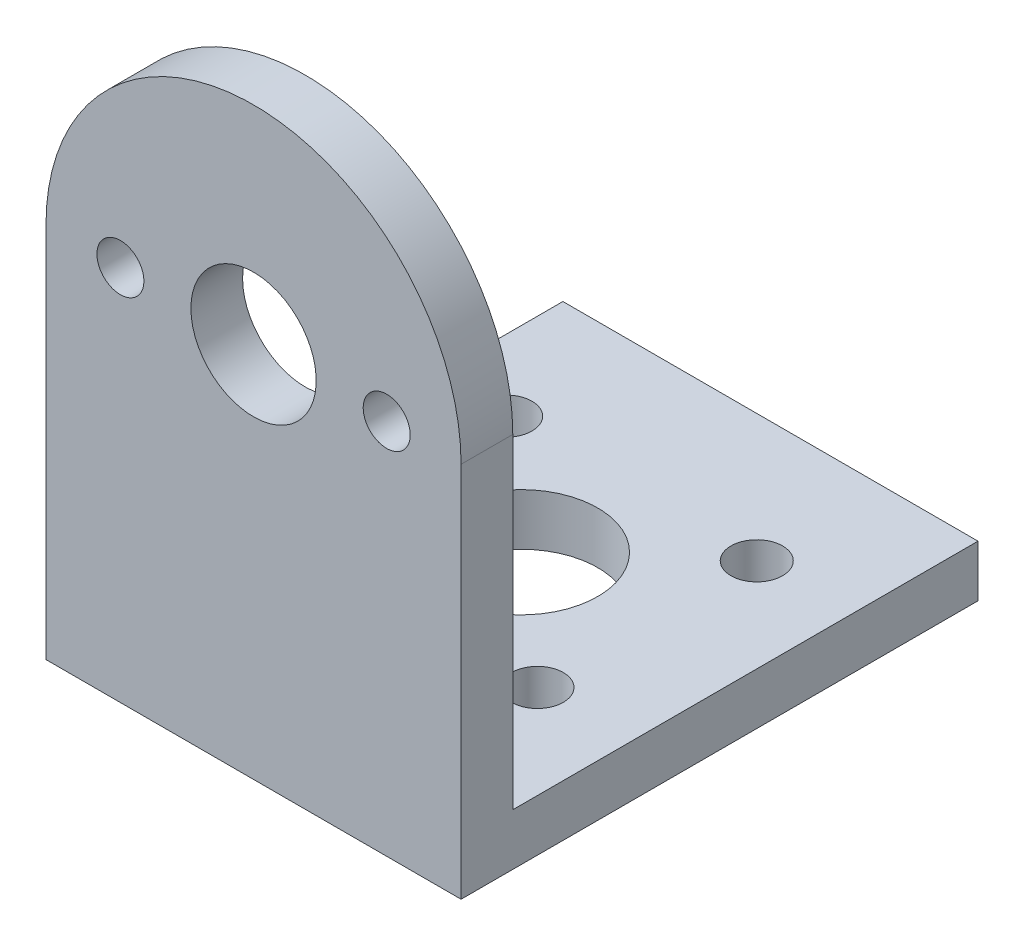
ISO-10303-21;
HEADER;
FILE_DESCRIPTION(('STEP AP214'),'2;1');
FILE_NAME('part.step','',(''),(''),'','','');
FILE_SCHEMA(('AUTOMOTIVE_DESIGN { 1 0 10303 214 1 1 1 1 }'));
ENDSEC;
DATA;
#1=APPLICATION_CONTEXT('core data for automotive mechanical design processes');
#2=APPLICATION_PROTOCOL_DEFINITION('international standard','automotive_design',2000,#1);
#3=PRODUCT_CONTEXT('',#1,'mechanical');
#4=PRODUCT('Part','Part','',(#3));
#5=PRODUCT_RELATED_PRODUCT_CATEGORY('part','',(#4));
#6=PRODUCT_DEFINITION_FORMATION('','',#4);
#7=PRODUCT_DEFINITION_CONTEXT('part definition',#1,'design');
#8=PRODUCT_DEFINITION('design','',#6,#7);
#9=PRODUCT_DEFINITION_SHAPE('','',#8);
#10=(LENGTH_UNIT() NAMED_UNIT(*) SI_UNIT(.MILLI.,.METRE.));
#11=(NAMED_UNIT(*) PLANE_ANGLE_UNIT() SI_UNIT($,.RADIAN.));
#12=(NAMED_UNIT(*) SI_UNIT($,.STERADIAN.) SOLID_ANGLE_UNIT());
#13=UNCERTAINTY_MEASURE_WITH_UNIT(LENGTH_MEASURE(1.E-05),#10,'distance_accuracy_value','');
#14=(GEOMETRIC_REPRESENTATION_CONTEXT(3) GLOBAL_UNCERTAINTY_ASSIGNED_CONTEXT((#13)) GLOBAL_UNIT_ASSIGNED_CONTEXT((#10,
#11,#12)) REPRESENTATION_CONTEXT('',''));
#15=CARTESIAN_POINT('',(0.,0.,0.));
#16=DIRECTION('',(0.,0.,1.));
#17=DIRECTION('',(1.,0.,0.));
#18=AXIS2_PLACEMENT_3D('',#15,#16,#17);
#19=CARTESIAN_POINT('',(0.,3.3,0.));
#20=DIRECTION('',(0.,0.,-1.));
#21=DIRECTION('',(-1.,0.,0.));
#22=AXIS2_PLACEMENT_3D('',#19,#20,#21);
#23=PLANE('',#22);
#24=CARTESIAN_POINT('',(21.75,24.05,0.));
#25=DIRECTION('',(0.,0.,-1.));
#26=DIRECTION('',(-1.,0.,0.));
#27=AXIS2_PLACEMENT_3D('',#24,#25,#26);
#28=CIRCLE('',#27,1.5);
#29=CARTESIAN_POINT('',(20.25,24.05,0.));
#30=VERTEX_POINT('',#29);
#31=EDGE_CURVE('E177',#30,#30,#28,.T.);
#32=ORIENTED_EDGE('',*,*,#31,.T.);
#33=EDGE_LOOP('',(#32));
#34=FACE_BOUND('',#33,.T.);
#35=CARTESIAN_POINT('',(4.75,24.05,0.));
#36=DIRECTION('',(0.,0.,-1.));
#37=DIRECTION('',(-1.,0.,0.));
#38=AXIS2_PLACEMENT_3D('',#35,#36,#37);
#39=CIRCLE('',#38,1.5);
#40=CARTESIAN_POINT('',(3.25,24.05,0.));
#41=VERTEX_POINT('',#40);
#42=EDGE_CURVE('E182',#41,#41,#39,.T.);
#43=ORIENTED_EDGE('',*,*,#42,.T.);
#44=EDGE_LOOP('',(#43));
#45=FACE_BOUND('',#44,.T.);
#46=CARTESIAN_POINT('',(13.25,24.05,0.));
#47=DIRECTION('',(0.,0.,-1.));
#48=DIRECTION('',(-1.,0.,0.));
#49=AXIS2_PLACEMENT_3D('',#46,#47,#48);
#50=CIRCLE('',#49,4.);
#51=CARTESIAN_POINT('',(9.25,24.05,0.));
#52=VERTEX_POINT('',#51);
#53=EDGE_CURVE('E185',#52,#52,#50,.T.);
#54=ORIENTED_EDGE('',*,*,#53,.T.);
#55=EDGE_LOOP('',(#54));
#56=FACE_BOUND('',#55,.T.);
#57=CARTESIAN_POINT('',(13.25,24.05,0.));
#58=DIRECTION('',(0.,0.,-1.));
#59=DIRECTION('',(-1.,0.,0.));
#60=AXIS2_PLACEMENT_3D('',#57,#58,#59);
#61=CIRCLE('',#60,13.25);
#62=CARTESIAN_POINT('',(0.,24.05,0.));
#63=VERTEX_POINT('',#62);
#64=CARTESIAN_POINT('',(26.5,24.05,0.));
#65=VERTEX_POINT('',#64);
#66=EDGE_CURVE('E121',#63,#65,#61,.T.);
#67=ORIENTED_EDGE('',*,*,#66,.F.);
#68=DIRECTION('',(0.,-1.,0.));
#69=VECTOR('',#68,1.);
#70=CARTESIAN_POINT('',(0.,3.3,0.));
#71=LINE('',#70,#69);
#72=CARTESIAN_POINT('',(0.,0.,0.));
#73=VERTEX_POINT('',#72);
#74=EDGE_CURVE('E45',#63,#73,#71,.T.);
#75=ORIENTED_EDGE('',*,*,#74,.T.);
#76=DIRECTION('',(1.,0.,0.));
#77=VECTOR('',#76,1.);
#78=CARTESIAN_POINT('',(0.,0.,0.));
#79=LINE('',#78,#77);
#80=CARTESIAN_POINT('',(26.5,0.,0.));
#81=VERTEX_POINT('',#80);
#82=EDGE_CURVE('E103',#73,#81,#79,.T.);
#83=ORIENTED_EDGE('',*,*,#82,.T.);
#84=DIRECTION('',(0.,-1.,0.));
#85=VECTOR('',#84,1.);
#86=CARTESIAN_POINT('',(26.5,3.3,0.));
#87=LINE('',#86,#85);
#88=EDGE_CURVE('E115',#65,#81,#87,.T.);
#89=ORIENTED_EDGE('',*,*,#88,.F.);
#90=EDGE_LOOP('',(#67,#75,#83,#89));
#91=FACE_BOUND('',#90,.T.);
#92=ADVANCED_FACE('F37',(#34,#45,#56,#91),#23,.F.);
#93=CARTESIAN_POINT('',(0.,37.3,-3.3));
#94=DIRECTION('',(0.,0.,1.));
#95=DIRECTION('',(1.,0.,0.));
#96=AXIS2_PLACEMENT_3D('',#93,#94,#95);
#97=PLANE('',#96);
#98=CARTESIAN_POINT('',(21.75,24.05,-3.3));
#99=DIRECTION('',(0.,0.,-1.));
#100=DIRECTION('',(-1.,0.,0.));
#101=AXIS2_PLACEMENT_3D('',#98,#99,#100);
#102=CIRCLE('',#101,1.5);
#103=CARTESIAN_POINT('',(20.25,24.05,-3.3));
#104=VERTEX_POINT('',#103);
#105=EDGE_CURVE('E192',#104,#104,#102,.T.);
#106=ORIENTED_EDGE('',*,*,#105,.F.);
#107=EDGE_LOOP('',(#106));
#108=FACE_BOUND('',#107,.T.);
#109=CARTESIAN_POINT('',(4.75,24.05,-3.3));
#110=DIRECTION('',(0.,0.,-1.));
#111=DIRECTION('',(-1.,0.,0.));
#112=AXIS2_PLACEMENT_3D('',#109,#110,#111);
#113=CIRCLE('',#112,1.5);
#114=CARTESIAN_POINT('',(3.25,24.05,-3.3));
#115=VERTEX_POINT('',#114);
#116=EDGE_CURVE('E191',#115,#115,#113,.T.);
#117=ORIENTED_EDGE('',*,*,#116,.F.);
#118=EDGE_LOOP('',(#117));
#119=FACE_BOUND('',#118,.T.);
#120=CARTESIAN_POINT('',(13.25,24.05,-3.3));
#121=DIRECTION('',(0.,0.,-1.));
#122=DIRECTION('',(-1.,0.,0.));
#123=AXIS2_PLACEMENT_3D('',#120,#121,#122);
#124=CIRCLE('',#123,4.);
#125=CARTESIAN_POINT('',(9.25,24.05,-3.3));
#126=VERTEX_POINT('',#125);
#127=EDGE_CURVE('E188',#126,#126,#124,.T.);
#128=ORIENTED_EDGE('',*,*,#127,.F.);
#129=EDGE_LOOP('',(#128));
#130=FACE_BOUND('',#129,.T.);
#131=DIRECTION('',(0.,-1.,0.));
#132=VECTOR('',#131,1.);
#133=CARTESIAN_POINT('',(0.,37.3,-3.3));
#134=LINE('',#133,#132);
#135=CARTESIAN_POINT('',(0.,24.05,-3.3));
#136=VERTEX_POINT('',#135);
#137=CARTESIAN_POINT('',(0.,3.3,-3.3));
#138=VERTEX_POINT('',#137);
#139=EDGE_CURVE('E133',#136,#138,#134,.T.);
#140=ORIENTED_EDGE('',*,*,#139,.F.);
#141=CARTESIAN_POINT('',(13.25,24.05,-3.3));
#142=DIRECTION('',(0.,0.,-1.));
#143=DIRECTION('',(-1.,0.,0.));
#144=AXIS2_PLACEMENT_3D('',#141,#142,#143);
#145=CIRCLE('',#144,13.25);
#146=CARTESIAN_POINT('',(26.5,24.05,-3.3));
#147=VERTEX_POINT('',#146);
#148=EDGE_CURVE('E176',#136,#147,#145,.T.);
#149=ORIENTED_EDGE('',*,*,#148,.T.);
#150=DIRECTION('',(0.,-1.,0.));
#151=VECTOR('',#150,1.);
#152=CARTESIAN_POINT('',(26.5,37.3,-3.3));
#153=LINE('',#152,#151);
#154=CARTESIAN_POINT('',(26.5,3.3,-3.3));
#155=VERTEX_POINT('',#154);
#156=EDGE_CURVE('E52',#147,#155,#153,.T.);
#157=ORIENTED_EDGE('',*,*,#156,.T.);
#158=DIRECTION('',(-1.,0.,0.));
#159=VECTOR('',#158,1.);
#160=CARTESIAN_POINT('',(0.,3.3,-3.3));
#161=LINE('',#160,#159);
#162=EDGE_CURVE('E134',#155,#138,#161,.T.);
#163=ORIENTED_EDGE('',*,*,#162,.T.);
#164=EDGE_LOOP('',(#140,#149,#157,#163));
#165=FACE_BOUND('',#164,.T.);
#166=ADVANCED_FACE('F140',(#108,#119,#130,#165),#97,.F.);
#167=CARTESIAN_POINT('',(26.5,3.3,0.));
#168=DIRECTION('',(-1.,0.,0.));
#169=DIRECTION('',(0.,0.,1.));
#170=AXIS2_PLACEMENT_3D('',#167,#168,#169);
#171=PLANE('',#170);
#172=DIRECTION('',(0.,0.,-1.));
#173=VECTOR('',#172,1.);
#174=CARTESIAN_POINT('',(26.5,24.05,30.7));
#175=LINE('',#174,#173);
#176=EDGE_CURVE('E142',#65,#147,#175,.T.);
#177=ORIENTED_EDGE('',*,*,#176,.F.);
#178=ORIENTED_EDGE('',*,*,#88,.T.);
#179=DIRECTION('',(0.,0.,-1.));
#180=VECTOR('',#179,1.);
#181=CARTESIAN_POINT('',(26.5,0.,0.));
#182=LINE('',#181,#180);
#183=CARTESIAN_POINT('',(26.5,0.,-33.));
#184=VERTEX_POINT('',#183);
#185=EDGE_CURVE('E91',#81,#184,#182,.T.);
#186=ORIENTED_EDGE('',*,*,#185,.T.);
#187=DIRECTION('',(0.,-1.,0.));
#188=VECTOR('',#187,1.);
#189=CARTESIAN_POINT('',(26.5,3.3,-33.));
#190=LINE('',#189,#188);
#191=CARTESIAN_POINT('',(26.5,3.3,-33.));
#192=VERTEX_POINT('',#191);
#193=EDGE_CURVE('E86',#192,#184,#190,.T.);
#194=ORIENTED_EDGE('',*,*,#193,.F.);
#195=DIRECTION('',(0.,0.,-1.));
#196=VECTOR('',#195,1.);
#197=CARTESIAN_POINT('',(26.5,3.3,0.));
#198=LINE('',#197,#196);
#199=EDGE_CURVE('E138',#155,#192,#198,.T.);
#200=ORIENTED_EDGE('',*,*,#199,.F.);
#201=ORIENTED_EDGE('',*,*,#156,.F.);
#202=EDGE_LOOP('',(#177,#178,#186,#194,#200,#201));
#203=FACE_BOUND('',#202,.T.);
#204=ADVANCED_FACE('F174',(#203),#171,.F.);
#205=CARTESIAN_POINT('',(0.,3.3,0.));
#206=DIRECTION('',(0.,-1.,0.));
#207=DIRECTION('',(0.,0.,-1.));
#208=AXIS2_PLACEMENT_3D('',#205,#206,#207);
#209=PLANE('',#208);
#210=CARTESIAN_POINT('',(20.5255800312338,3.3,-10.85));
#211=DIRECTION('',(0.,1.,0.));
#212=DIRECTION('',(0.,0.,1.));
#213=AXIS2_PLACEMENT_3D('',#210,#211,#212);
#214=CIRCLE('',#213,1.65);
#215=CARTESIAN_POINT('',(20.5255800312338,3.3,-9.2));
#216=VERTEX_POINT('',#215);
#217=EDGE_CURVE('E148',#216,#216,#214,.T.);
#218=ORIENTED_EDGE('',*,*,#217,.F.);
#219=EDGE_LOOP('',(#218));
#220=FACE_BOUND('',#219,.T.);
#221=CARTESIAN_POINT('',(4.5255800312338,3.3,-10.85));
#222=DIRECTION('',(0.,1.,0.));
#223=DIRECTION('',(0.,0.,1.));
#224=AXIS2_PLACEMENT_3D('',#221,#222,#223);
#225=CIRCLE('',#224,1.65);
#226=CARTESIAN_POINT('',(4.5255800312338,3.3,-9.2));
#227=VERTEX_POINT('',#226);
#228=EDGE_CURVE('E154',#227,#227,#225,.T.);
#229=ORIENTED_EDGE('',*,*,#228,.F.);
#230=EDGE_LOOP('',(#229));
#231=FACE_BOUND('',#230,.T.);
#232=CARTESIAN_POINT('',(20.5255800312338,3.3,-24.85));
#233=DIRECTION('',(0.,1.,0.));
#234=DIRECTION('',(0.,0.,-1.));
#235=AXIS2_PLACEMENT_3D('',#232,#233,#234);
#236=CIRCLE('',#235,1.65);
#237=CARTESIAN_POINT('',(20.5255800312338,3.3,-26.5));
#238=VERTEX_POINT('',#237);
#239=EDGE_CURVE('E160',#238,#238,#236,.T.);
#240=ORIENTED_EDGE('',*,*,#239,.F.);
#241=EDGE_LOOP('',(#240));
#242=FACE_BOUND('',#241,.T.);
#243=CARTESIAN_POINT('',(4.5255800312338,3.3,-24.85));
#244=DIRECTION('',(0.,1.,0.));
#245=DIRECTION('',(0.,0.,1.));
#246=AXIS2_PLACEMENT_3D('',#243,#244,#245);
#247=CIRCLE('',#246,1.65);
#248=CARTESIAN_POINT('',(4.5255800312338,3.3,-23.2));
#249=VERTEX_POINT('',#248);
#250=EDGE_CURVE('E166',#249,#249,#247,.T.);
#251=ORIENTED_EDGE('',*,*,#250,.F.);
#252=EDGE_LOOP('',(#251));
#253=FACE_BOUND('',#252,.T.);
#254=CARTESIAN_POINT('',(12.5255800312338,3.3,-17.8));
#255=DIRECTION('',(0.,1.,0.));
#256=DIRECTION('',(0.,0.,1.));
#257=AXIS2_PLACEMENT_3D('',#254,#255,#256);
#258=CIRCLE('',#257,4.9);
#259=CARTESIAN_POINT('',(12.5255800312338,3.3,-12.9));
#260=VERTEX_POINT('',#259);
#261=EDGE_CURVE('E104',#260,#260,#258,.T.);
#262=ORIENTED_EDGE('',*,*,#261,.F.);
#263=EDGE_LOOP('',(#262));
#264=FACE_BOUND('',#263,.T.);
#265=ORIENTED_EDGE('',*,*,#162,.F.);
#266=ORIENTED_EDGE('',*,*,#199,.T.);
#267=DIRECTION('',(-1.,0.,0.));
#268=VECTOR('',#267,1.);
#269=CARTESIAN_POINT('',(0.,3.3,-33.));
#270=LINE('',#269,#268);
#271=CARTESIAN_POINT('',(0.,3.3,-33.));
#272=VERTEX_POINT('',#271);
#273=EDGE_CURVE('E61',#192,#272,#270,.T.);
#274=ORIENTED_EDGE('',*,*,#273,.T.);
#275=DIRECTION('',(0.,0.,1.));
#276=VECTOR('',#275,1.);
#277=CARTESIAN_POINT('',(0.,3.3,0.));
#278=LINE('',#277,#276);
#279=EDGE_CURVE('E90',#272,#138,#278,.T.);
#280=ORIENTED_EDGE('',*,*,#279,.T.);
#281=EDGE_LOOP('',(#265,#266,#274,#280));
#282=FACE_BOUND('',#281,.T.);
#283=ADVANCED_FACE('F136',(#220,#231,#242,#253,#264,#282),#209,.F.);
#284=CARTESIAN_POINT('',(0.,0.,0.));
#285=DIRECTION('',(0.,-1.,0.));
#286=DIRECTION('',(0.,0.,-1.));
#287=AXIS2_PLACEMENT_3D('',#284,#285,#286);
#288=PLANE('',#287);
#289=CARTESIAN_POINT('',(4.5255800312338,0.,-10.85));
#290=DIRECTION('',(0.,1.,0.));
#291=DIRECTION('',(0.,0.,1.));
#292=AXIS2_PLACEMENT_3D('',#289,#290,#291);
#293=CIRCLE('',#292,1.65);
#294=CARTESIAN_POINT('',(4.5255800312338,0.,-9.2));
#295=VERTEX_POINT('',#294);
#296=EDGE_CURVE('E151',#295,#295,#293,.T.);
#297=ORIENTED_EDGE('',*,*,#296,.T.);
#298=EDGE_LOOP('',(#297));
#299=FACE_BOUND('',#298,.T.);
#300=CARTESIAN_POINT('',(4.5255800312338,0.,-24.85));
#301=DIRECTION('',(0.,1.,0.));
#302=DIRECTION('',(0.,0.,1.));
#303=AXIS2_PLACEMENT_3D('',#300,#301,#302);
#304=CIRCLE('',#303,1.65);
#305=CARTESIAN_POINT('',(4.5255800312338,0.,-23.2));
#306=VERTEX_POINT('',#305);
#307=EDGE_CURVE('E163',#306,#306,#304,.T.);
#308=ORIENTED_EDGE('',*,*,#307,.T.);
#309=EDGE_LOOP('',(#308));
#310=FACE_BOUND('',#309,.T.);
#311=DIRECTION('',(0.,0.,1.));
#312=VECTOR('',#311,1.);
#313=CARTESIAN_POINT('',(0.,0.,0.));
#314=LINE('',#313,#312);
#315=CARTESIAN_POINT('',(0.,0.,-33.));
#316=VERTEX_POINT('',#315);
#317=EDGE_CURVE('E96',#316,#73,#314,.T.);
#318=ORIENTED_EDGE('',*,*,#317,.F.);
#319=DIRECTION('',(-1.,0.,0.));
#320=VECTOR('',#319,1.);
#321=CARTESIAN_POINT('',(0.,0.,-33.));
#322=LINE('',#321,#320);
#323=EDGE_CURVE('E80',#184,#316,#322,.T.);
#324=ORIENTED_EDGE('',*,*,#323,.F.);
#325=ORIENTED_EDGE('',*,*,#185,.F.);
#326=ORIENTED_EDGE('',*,*,#82,.F.);
#327=EDGE_LOOP('',(#318,#324,#325,#326));
#328=FACE_BOUND('',#327,.T.);
#329=CARTESIAN_POINT('',(12.5255800312338,0.,-17.8));
#330=DIRECTION('',(0.,1.,0.));
#331=DIRECTION('',(0.,0.,1.));
#332=AXIS2_PLACEMENT_3D('',#329,#330,#331);
#333=CIRCLE('',#332,4.9);
#334=CARTESIAN_POINT('',(12.5255800312338,0.,-12.9));
#335=VERTEX_POINT('',#334);
#336=EDGE_CURVE('E108',#335,#335,#333,.T.);
#337=ORIENTED_EDGE('',*,*,#336,.T.);
#338=EDGE_LOOP('',(#337));
#339=FACE_BOUND('',#338,.T.);
#340=CARTESIAN_POINT('',(20.5255800312338,0.,-24.85));
#341=DIRECTION('',(0.,1.,0.));
#342=DIRECTION('',(0.,0.,-1.));
#343=AXIS2_PLACEMENT_3D('',#340,#341,#342);
#344=CIRCLE('',#343,1.65);
#345=CARTESIAN_POINT('',(20.5255800312338,0.,-26.5));
#346=VERTEX_POINT('',#345);
#347=EDGE_CURVE('E157',#346,#346,#344,.T.);
#348=ORIENTED_EDGE('',*,*,#347,.T.);
#349=EDGE_LOOP('',(#348));
#350=FACE_BOUND('',#349,.T.);
#351=CARTESIAN_POINT('',(20.5255800312338,0.,-10.85));
#352=DIRECTION('',(0.,1.,0.));
#353=DIRECTION('',(0.,0.,1.));
#354=AXIS2_PLACEMENT_3D('',#351,#352,#353);
#355=CIRCLE('',#354,1.65);
#356=CARTESIAN_POINT('',(20.5255800312338,0.,-9.2));
#357=VERTEX_POINT('',#356);
#358=EDGE_CURVE('E147',#357,#357,#355,.T.);
#359=ORIENTED_EDGE('',*,*,#358,.T.);
#360=EDGE_LOOP('',(#359));
#361=FACE_BOUND('',#360,.T.);
#362=ADVANCED_FACE('F100',(#299,#310,#328,#339,#350,#361),#288,.T.);
#363=CARTESIAN_POINT('',(0.,3.3,0.));
#364=DIRECTION('',(1.,0.,0.));
#365=DIRECTION('',(0.,0.,-1.));
#366=AXIS2_PLACEMENT_3D('',#363,#364,#365);
#367=PLANE('',#366);
#368=ORIENTED_EDGE('',*,*,#74,.F.);
#369=DIRECTION('',(0.,0.,-1.));
#370=VECTOR('',#369,1.);
#371=CARTESIAN_POINT('',(0.,24.05,30.7));
#372=LINE('',#371,#370);
#373=EDGE_CURVE('E11',#63,#136,#372,.T.);
#374=ORIENTED_EDGE('',*,*,#373,.T.);
#375=ORIENTED_EDGE('',*,*,#139,.T.);
#376=ORIENTED_EDGE('',*,*,#279,.F.);
#377=DIRECTION('',(0.,-1.,0.));
#378=VECTOR('',#377,1.);
#379=CARTESIAN_POINT('',(0.,3.3,-33.));
#380=LINE('',#379,#378);
#381=EDGE_CURVE('E83',#272,#316,#380,.T.);
#382=ORIENTED_EDGE('',*,*,#381,.T.);
#383=ORIENTED_EDGE('',*,*,#317,.T.);
#384=EDGE_LOOP('',(#368,#374,#375,#376,#382,#383));
#385=FACE_BOUND('',#384,.T.);
#386=ADVANCED_FACE('F39',(#385),#367,.F.);
#387=CARTESIAN_POINT('',(0.,3.3,-33.));
#388=DIRECTION('',(0.,0.,1.));
#389=DIRECTION('',(1.,0.,0.));
#390=AXIS2_PLACEMENT_3D('',#387,#388,#389);
#391=PLANE('',#390);
#392=ORIENTED_EDGE('',*,*,#323,.T.);
#393=ORIENTED_EDGE('',*,*,#381,.F.);
#394=ORIENTED_EDGE('',*,*,#273,.F.);
#395=ORIENTED_EDGE('',*,*,#193,.T.);
#396=EDGE_LOOP('',(#392,#393,#394,#395));
#397=FACE_BOUND('',#396,.T.);
#398=ADVANCED_FACE('F82',(#397),#391,.F.);
#399=CARTESIAN_POINT('',(12.5255800312338,3.3,-17.8));
#400=DIRECTION('',(0.,-1.,0.));
#401=DIRECTION('',(0.,0.,-1.));
#402=AXIS2_PLACEMENT_3D('',#399,#400,#401);
#403=CYLINDRICAL_SURFACE('',#402,4.9);
#404=ORIENTED_EDGE('',*,*,#261,.T.);
#405=EDGE_LOOP('',(#404));
#406=FACE_BOUND('',#405,.T.);
#407=ORIENTED_EDGE('',*,*,#336,.F.);
#408=EDGE_LOOP('',(#407));
#409=FACE_BOUND('',#408,.T.);
#410=ADVANCED_FACE('F224',(#406,#409),#403,.F.);
#411=CARTESIAN_POINT('',(4.5255800312338,3.3,-24.85));
#412=DIRECTION('',(0.,-1.,0.));
#413=DIRECTION('',(0.,0.,-1.));
#414=AXIS2_PLACEMENT_3D('',#411,#412,#413);
#415=CYLINDRICAL_SURFACE('',#414,1.65);
#416=ORIENTED_EDGE('',*,*,#250,.T.);
#417=EDGE_LOOP('',(#416));
#418=FACE_BOUND('',#417,.T.);
#419=ORIENTED_EDGE('',*,*,#307,.F.);
#420=EDGE_LOOP('',(#419));
#421=FACE_BOUND('',#420,.T.);
#422=ADVANCED_FACE('F233',(#418,#421),#415,.F.);
#423=CARTESIAN_POINT('',(20.5255800312338,3.3,-24.85));
#424=DIRECTION('',(0.,-1.,0.));
#425=DIRECTION('',(0.,0.,-1.));
#426=AXIS2_PLACEMENT_3D('',#423,#424,#425);
#427=CYLINDRICAL_SURFACE('',#426,1.65);
#428=ORIENTED_EDGE('',*,*,#239,.T.);
#429=EDGE_LOOP('',(#428));
#430=FACE_BOUND('',#429,.T.);
#431=ORIENTED_EDGE('',*,*,#347,.F.);
#432=EDGE_LOOP('',(#431));
#433=FACE_BOUND('',#432,.T.);
#434=ADVANCED_FACE('F237',(#430,#433),#427,.F.);
#435=CARTESIAN_POINT('',(4.5255800312338,3.3,-10.85));
#436=DIRECTION('',(0.,-1.,0.));
#437=DIRECTION('',(0.,0.,-1.));
#438=AXIS2_PLACEMENT_3D('',#435,#436,#437);
#439=CYLINDRICAL_SURFACE('',#438,1.65);
#440=ORIENTED_EDGE('',*,*,#228,.T.);
#441=EDGE_LOOP('',(#440));
#442=FACE_BOUND('',#441,.T.);
#443=ORIENTED_EDGE('',*,*,#296,.F.);
#444=EDGE_LOOP('',(#443));
#445=FACE_BOUND('',#444,.T.);
#446=ADVANCED_FACE('F241',(#442,#445),#439,.F.);
#447=CARTESIAN_POINT('',(20.5255800312338,3.3,-10.85));
#448=DIRECTION('',(0.,-1.,0.));
#449=DIRECTION('',(0.,0.,-1.));
#450=AXIS2_PLACEMENT_3D('',#447,#448,#449);
#451=CYLINDRICAL_SURFACE('',#450,1.65);
#452=ORIENTED_EDGE('',*,*,#217,.T.);
#453=EDGE_LOOP('',(#452));
#454=FACE_BOUND('',#453,.T.);
#455=ORIENTED_EDGE('',*,*,#358,.F.);
#456=EDGE_LOOP('',(#455));
#457=FACE_BOUND('',#456,.T.);
#458=ADVANCED_FACE('F245',(#454,#457),#451,.F.);
#459=CARTESIAN_POINT('',(13.25,24.05,30.7));
#460=DIRECTION('',(0.,0.,-1.));
#461=DIRECTION('',(-1.,0.,0.));
#462=AXIS2_PLACEMENT_3D('',#459,#460,#461);
#463=CYLINDRICAL_SURFACE('',#462,13.25);
#464=ORIENTED_EDGE('',*,*,#66,.T.);
#465=ORIENTED_EDGE('',*,*,#176,.T.);
#466=ORIENTED_EDGE('',*,*,#148,.F.);
#467=ORIENTED_EDGE('',*,*,#373,.F.);
#468=EDGE_LOOP('',(#464,#465,#466,#467));
#469=FACE_BOUND('',#468,.T.);
#470=ADVANCED_FACE('F210',(#469),#463,.T.);
#471=CARTESIAN_POINT('',(13.25,24.05,30.7));
#472=DIRECTION('',(0.,0.,-1.));
#473=DIRECTION('',(-1.,0.,0.));
#474=AXIS2_PLACEMENT_3D('',#471,#472,#473);
#475=CYLINDRICAL_SURFACE('',#474,4.);
#476=ORIENTED_EDGE('',*,*,#127,.T.);
#477=EDGE_LOOP('',(#476));
#478=FACE_BOUND('',#477,.T.);
#479=ORIENTED_EDGE('',*,*,#53,.F.);
#480=EDGE_LOOP('',(#479));
#481=FACE_BOUND('',#480,.T.);
#482=ADVANCED_FACE('F207',(#478,#481),#475,.F.);
#483=CARTESIAN_POINT('',(4.75,24.05,30.7));
#484=DIRECTION('',(0.,0.,-1.));
#485=DIRECTION('',(-1.,0.,0.));
#486=AXIS2_PLACEMENT_3D('',#483,#484,#485);
#487=CYLINDRICAL_SURFACE('',#486,1.5);
#488=ORIENTED_EDGE('',*,*,#116,.T.);
#489=EDGE_LOOP('',(#488));
#490=FACE_BOUND('',#489,.T.);
#491=ORIENTED_EDGE('',*,*,#42,.F.);
#492=EDGE_LOOP('',(#491));
#493=FACE_BOUND('',#492,.T.);
#494=ADVANCED_FACE('F198',(#490,#493),#487,.F.);
#495=CARTESIAN_POINT('',(21.75,24.05,30.7));
#496=DIRECTION('',(0.,0.,-1.));
#497=DIRECTION('',(-1.,0.,0.));
#498=AXIS2_PLACEMENT_3D('',#495,#496,#497);
#499=CYLINDRICAL_SURFACE('',#498,1.5);
#500=ORIENTED_EDGE('',*,*,#105,.T.);
#501=EDGE_LOOP('',(#500));
#502=FACE_BOUND('',#501,.T.);
#503=ORIENTED_EDGE('',*,*,#31,.F.);
#504=EDGE_LOOP('',(#503));
#505=FACE_BOUND('',#504,.T.);
#506=ADVANCED_FACE('F252',(#502,#505),#499,.F.);
#507=CLOSED_SHELL('',(#92,#166,#204,#283,#362,#386,#398,#410,#422,#434,#446,#458,#470,#482,#494,#506));
#508=MANIFOLD_SOLID_BREP('B2',#507);
#509=ADVANCED_BREP_SHAPE_REPRESENTATION('',(#18,#508),#14);
#510=SHAPE_DEFINITION_REPRESENTATION(#9,#509);
ENDSEC;
END-ISO-10303-21;
